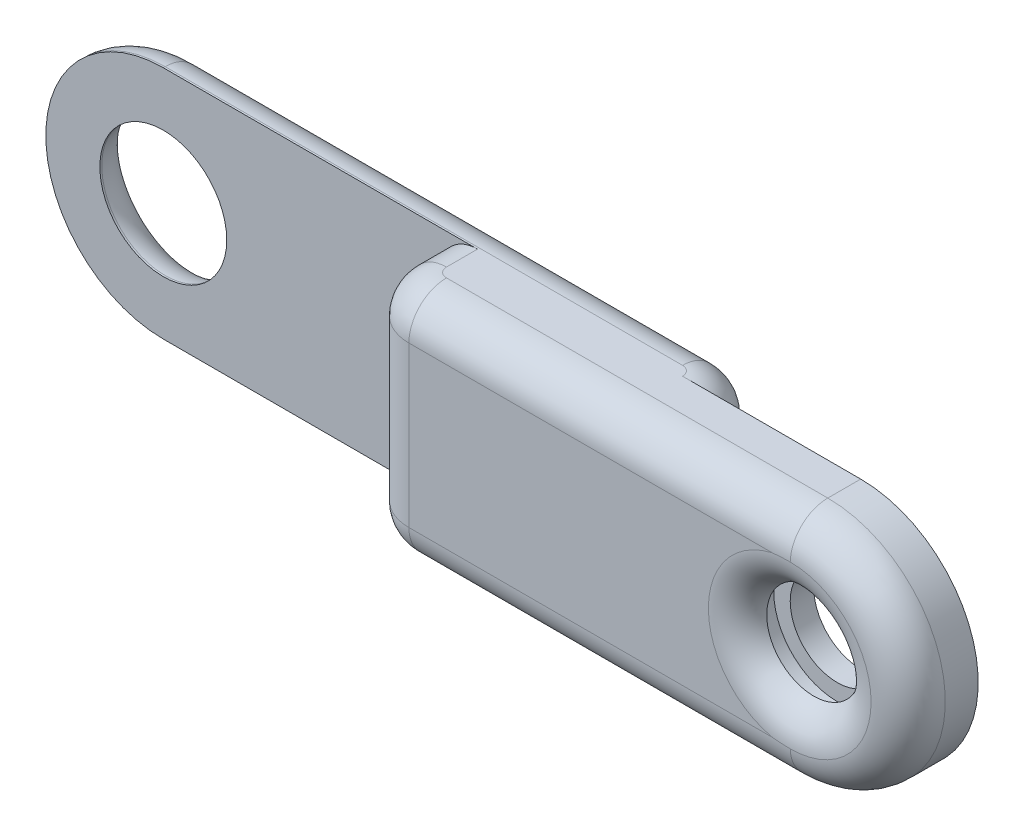
ISO-10303-21;
HEADER;
FILE_DESCRIPTION(('STEP AP214'),'2;1');
FILE_NAME('part.step','',(''),(''),'','','');
FILE_SCHEMA(('AUTOMOTIVE_DESIGN { 1 0 10303 214 1 1 1 1 }'));
ENDSEC;
DATA;
#1=APPLICATION_CONTEXT('core data for automotive mechanical design processes');
#2=APPLICATION_PROTOCOL_DEFINITION('international standard','automotive_design',2000,#1);
#3=PRODUCT_CONTEXT('',#1,'mechanical');
#4=PRODUCT('Part','Part','',(#3));
#5=PRODUCT_RELATED_PRODUCT_CATEGORY('part','',(#4));
#6=PRODUCT_DEFINITION_FORMATION('','',#4);
#7=PRODUCT_DEFINITION_CONTEXT('part definition',#1,'design');
#8=PRODUCT_DEFINITION('design','',#6,#7);
#9=PRODUCT_DEFINITION_SHAPE('','',#8);
#10=(LENGTH_UNIT() NAMED_UNIT(*) SI_UNIT(.MILLI.,.METRE.));
#11=(NAMED_UNIT(*) PLANE_ANGLE_UNIT() SI_UNIT($,.RADIAN.));
#12=(NAMED_UNIT(*) SI_UNIT($,.STERADIAN.) SOLID_ANGLE_UNIT());
#13=UNCERTAINTY_MEASURE_WITH_UNIT(LENGTH_MEASURE(1.E-05),#10,'distance_accuracy_value','');
#14=(GEOMETRIC_REPRESENTATION_CONTEXT(3) GLOBAL_UNCERTAINTY_ASSIGNED_CONTEXT((#13)) GLOBAL_UNIT_ASSIGNED_CONTEXT((#10,
#11,#12)) REPRESENTATION_CONTEXT('',''));
#15=CARTESIAN_POINT('',(0.,0.,0.));
#16=DIRECTION('',(0.,0.,1.));
#17=DIRECTION('',(1.,0.,0.));
#18=AXIS2_PLACEMENT_3D('',#15,#16,#17);
#19=CARTESIAN_POINT('',(-154.944852941176,0.,25.));
#20=DIRECTION('',(0.,0.,-1.));
#21=DIRECTION('',(-1.,0.,0.));
#22=AXIS2_PLACEMENT_3D('',#19,#20,#21);
#23=CYLINDRICAL_SURFACE('',#22,25.);
#24=DIRECTION('',(0.,0.,-1.));
#25=VECTOR('',#24,1.);
#26=CARTESIAN_POINT('',(-154.944852941176,25.,25.));
#27=LINE('',#26,#25);
#28=CARTESIAN_POINT('',(-154.944852941176,25.,8.4));
#29=VERTEX_POINT('',#28);
#30=CARTESIAN_POINT('',(-154.944852941176,25.,8.));
#31=VERTEX_POINT('',#30);
#32=EDGE_CURVE('E509',#29,#31,#27,.T.);
#33=ORIENTED_EDGE('',*,*,#32,.T.);
#34=CARTESIAN_POINT('',(-154.944852941176,0.,8.));
#35=DIRECTION('',(0.,0.,1.));
#36=DIRECTION('',(1.,0.,0.));
#37=AXIS2_PLACEMENT_3D('',#34,#35,#36);
#38=CIRCLE('',#37,25.);
#39=CARTESIAN_POINT('',(-154.944852941176,-25.,8.));
#40=VERTEX_POINT('',#39);
#41=EDGE_CURVE('E302',#31,#40,#38,.T.);
#42=ORIENTED_EDGE('',*,*,#41,.T.);
#43=DIRECTION('',(0.,0.,-1.));
#44=VECTOR('',#43,1.);
#45=CARTESIAN_POINT('',(-154.944852941176,-25.,25.));
#46=LINE('',#45,#44);
#47=CARTESIAN_POINT('',(-154.944852941176,-25.,8.4));
#48=VERTEX_POINT('',#47);
#49=EDGE_CURVE('E518',#48,#40,#46,.T.);
#50=ORIENTED_EDGE('',*,*,#49,.F.);
#51=CARTESIAN_POINT('',(-154.944852941176,0.,8.4));
#52=DIRECTION('',(0.,0.,1.));
#53=DIRECTION('',(1.,0.,0.));
#54=AXIS2_PLACEMENT_3D('',#51,#52,#53);
#55=CIRCLE('',#54,25.);
#56=EDGE_CURVE('E245',#29,#48,#55,.T.);
#57=ORIENTED_EDGE('',*,*,#56,.F.);
#58=EDGE_LOOP('',(#33,#42,#50,#57));
#59=FACE_BOUND('',#58,.T.);
#60=ADVANCED_FACE('F42',(#59),#23,.T.);
#61=CARTESIAN_POINT('',(-154.944852941176,0.,0.));
#62=DIRECTION('',(0.,0.,1.));
#63=DIRECTION('',(1.,0.,0.));
#64=AXIS2_PLACEMENT_3D('',#61,#62,#63);
#65=CYLINDRICAL_SURFACE('',#64,13.5);
#66=CARTESIAN_POINT('',(-154.944852941176,0.,8.));
#67=DIRECTION('',(0.,0.,1.));
#68=DIRECTION('',(1.,0.,0.));
#69=AXIS2_PLACEMENT_3D('',#66,#67,#68);
#70=CIRCLE('',#69,13.5);
#71=CARTESIAN_POINT('',(-141.444852941176,0.,8.));
#72=VERTEX_POINT('',#71);
#73=EDGE_CURVE('E314',#72,#72,#70,.F.);
#74=ORIENTED_EDGE('',*,*,#73,.T.);
#75=EDGE_LOOP('',(#74));
#76=FACE_BOUND('',#75,.T.);
#77=CARTESIAN_POINT('',(-154.944852941176,0.,8.4));
#78=DIRECTION('',(0.,0.,1.));
#79=DIRECTION('',(1.,0.,0.));
#80=AXIS2_PLACEMENT_3D('',#77,#78,#79);
#81=CIRCLE('',#80,13.5);
#82=CARTESIAN_POINT('',(-141.444852941176,0.,8.4));
#83=VERTEX_POINT('',#82);
#84=EDGE_CURVE('E532',#83,#83,#81,.F.);
#85=ORIENTED_EDGE('',*,*,#84,.F.);
#86=EDGE_LOOP('',(#85));
#87=FACE_BOUND('',#86,.T.);
#88=ADVANCED_FACE('F131',(#76,#87),#65,.F.);
#89=CARTESIAN_POINT('',(-4.94485294117644,0.,25.));
#90=DIRECTION('',(0.,0.,-1.));
#91=DIRECTION('',(-1.,0.,0.));
#92=AXIS2_PLACEMENT_3D('',#89,#90,#91);
#93=CYLINDRICAL_SURFACE('',#92,25.);
#94=DIRECTION('',(0.,0.,-1.));
#95=VECTOR('',#94,1.);
#96=CARTESIAN_POINT('',(-4.94485294117644,25.,25.));
#97=LINE('',#96,#95);
#98=CARTESIAN_POINT('',(-4.94485294117644,25.,17.));
#99=VERTEX_POINT('',#98);
#100=CARTESIAN_POINT('',(-4.94485294117644,25.,10.));
#101=VERTEX_POINT('',#100);
#102=EDGE_CURVE('E512',#99,#101,#97,.T.);
#103=ORIENTED_EDGE('',*,*,#102,.F.);
#104=CARTESIAN_POINT('',(-4.94485294117644,0.,17.));
#105=DIRECTION('',(0.,0.,1.));
#106=DIRECTION('',(1.,0.,0.));
#107=AXIS2_PLACEMENT_3D('',#104,#105,#106);
#108=CIRCLE('',#107,25.);
#109=CARTESIAN_POINT('',(-4.94485294117645,-25.,17.));
#110=VERTEX_POINT('',#109);
#111=EDGE_CURVE('E306',#99,#110,#108,.F.);
#112=ORIENTED_EDGE('',*,*,#111,.T.);
#113=DIRECTION('',(0.,0.,-1.));
#114=VECTOR('',#113,1.);
#115=CARTESIAN_POINT('',(-4.94485294117645,-25.,25.));
#116=LINE('',#115,#114);
#117=CARTESIAN_POINT('',(-4.94485294117644,-25.,10.));
#118=VERTEX_POINT('',#117);
#119=EDGE_CURVE('E515',#110,#118,#116,.T.);
#120=ORIENTED_EDGE('',*,*,#119,.T.);
#121=CARTESIAN_POINT('',(-4.94485294117644,0.,10.));
#122=DIRECTION('',(0.,0.,-1.));
#123=DIRECTION('',(-1.,0.,0.));
#124=AXIS2_PLACEMENT_3D('',#121,#122,#123);
#125=CIRCLE('',#124,25.);
#126=EDGE_CURVE('E497',#101,#118,#125,.T.);
#127=ORIENTED_EDGE('',*,*,#126,.F.);
#128=EDGE_LOOP('',(#103,#112,#120,#127));
#129=FACE_BOUND('',#128,.T.);
#130=ADVANCED_FACE('F139',(#129),#93,.T.);
#131=CARTESIAN_POINT('',(-4.94485294117644,0.,15.));
#132=DIRECTION('',(0.,0.,-1.));
#133=DIRECTION('',(-1.,0.,0.));
#134=AXIS2_PLACEMENT_3D('',#131,#132,#133);
#135=CYLINDRICAL_SURFACE('',#134,9.99999999999997);
#136=CARTESIAN_POINT('',(-4.94485294117644,0.,15.));
#137=DIRECTION('',(0.,0.,-1.));
#138=DIRECTION('',(-1.,0.,0.));
#139=AXIS2_PLACEMENT_3D('',#136,#137,#138);
#140=CIRCLE('',#139,9.99999999999997);
#141=CARTESIAN_POINT('',(-14.9448529411764,0.,15.));
#142=VERTEX_POINT('',#141);
#143=EDGE_CURVE('E501',#142,#142,#140,.T.);
#144=ORIENTED_EDGE('',*,*,#143,.F.);
#145=EDGE_LOOP('',(#144));
#146=FACE_BOUND('',#145,.T.);
#147=CARTESIAN_POINT('',(-4.94485294117644,0.,10.));
#148=DIRECTION('',(0.,0.,-1.));
#149=DIRECTION('',(-1.,0.,0.));
#150=AXIS2_PLACEMENT_3D('',#147,#148,#149);
#151=CIRCLE('',#150,9.99999999999997);
#152=CARTESIAN_POINT('',(-14.9448529411764,0.,10.));
#153=VERTEX_POINT('',#152);
#154=EDGE_CURVE('E495',#153,#153,#151,.F.);
#155=ORIENTED_EDGE('',*,*,#154,.F.);
#156=EDGE_LOOP('',(#155));
#157=FACE_BOUND('',#156,.T.);
#158=ADVANCED_FACE('F565',(#146,#157),#135,.F.);
#159=CARTESIAN_POINT('',(-4.94485294117644,0.,0.));
#160=DIRECTION('',(0.,0.,1.));
#161=DIRECTION('',(1.,0.,0.));
#162=AXIS2_PLACEMENT_3D('',#159,#160,#161);
#163=CYLINDRICAL_SURFACE('',#162,13.4999999999999);
#164=CARTESIAN_POINT('',(-4.94485294117644,0.,20.));
#165=DIRECTION('',(0.,0.,1.));
#166=DIRECTION('',(1.,0.,0.));
#167=AXIS2_PLACEMENT_3D('',#164,#165,#166);
#168=CIRCLE('',#167,13.4999999999999);
#169=CARTESIAN_POINT('',(8.5551470588235,0.,20.));
#170=VERTEX_POINT('',#169);
#171=EDGE_CURVE('E521',#170,#170,#168,.F.);
#172=ORIENTED_EDGE('',*,*,#171,.F.);
#173=EDGE_LOOP('',(#172));
#174=FACE_BOUND('',#173,.T.);
#175=CARTESIAN_POINT('',(-4.94485294117644,0.,15.));
#176=DIRECTION('',(0.,0.,-1.));
#177=DIRECTION('',(-1.,0.,0.));
#178=AXIS2_PLACEMENT_3D('',#175,#176,#177);
#179=CIRCLE('',#178,13.4999999999999);
#180=CARTESIAN_POINT('',(-18.4448529411764,0.,15.));
#181=VERTEX_POINT('',#180);
#182=EDGE_CURVE('E525',#181,#181,#179,.F.);
#183=ORIENTED_EDGE('',*,*,#182,.F.);
#184=EDGE_LOOP('',(#183));
#185=FACE_BOUND('',#184,.T.);
#186=ADVANCED_FACE('F570',(#174,#185),#163,.F.);
#187=CARTESIAN_POINT('',(-154.944852941176,-25.,25.));
#188=DIRECTION('',(0.,1.,0.));
#189=DIRECTION('',(0.,0.,1.));
#190=AXIS2_PLACEMENT_3D('',#187,#188,#189);
#191=PLANE('',#190);
#192=DIRECTION('',(0.,0.,1.));
#193=VECTOR('',#192,1.);
#194=CARTESIAN_POINT('',(-88.0847887574658,-25.,25.));
#195=LINE('',#194,#193);
#196=CARTESIAN_POINT('',(-88.0847887574658,-25.,15.));
#197=VERTEX_POINT('',#196);
#198=CARTESIAN_POINT('',(-88.0847887574658,-25.,8.4));
#199=VERTEX_POINT('',#198);
#200=EDGE_CURVE('E437',#197,#199,#195,.F.);
#201=ORIENTED_EDGE('',*,*,#200,.T.);
#202=DIRECTION('',(1.,0.,0.));
#203=VECTOR('',#202,1.);
#204=CARTESIAN_POINT('',(-96.0847887574658,-25.,8.4));
#205=LINE('',#204,#203);
#206=EDGE_CURVE('E545',#48,#199,#205,.T.);
#207=ORIENTED_EDGE('',*,*,#206,.F.);
#208=ORIENTED_EDGE('',*,*,#49,.T.);
#209=DIRECTION('',(1.,0.,0.));
#210=VECTOR('',#209,1.);
#211=CARTESIAN_POINT('',(-154.944852941176,-25.,8.));
#212=LINE('',#211,#210);
#213=CARTESIAN_POINT('',(-44.8505925481879,-25.,8.));
#214=VERTEX_POINT('',#213);
#215=EDGE_CURVE('E94',#40,#214,#212,.T.);
#216=ORIENTED_EDGE('',*,*,#215,.T.);
#217=CARTESIAN_POINT('',(-44.8505925481879,-25.,10.));
#218=DIRECTION('',(0.,1.,0.));
#219=DIRECTION('',(0.,0.,1.));
#220=AXIS2_PLACEMENT_3D('',#217,#218,#219);
#221=CIRCLE('',#220,2.);
#222=CARTESIAN_POINT('',(-42.8505925481879,-25.,10.));
#223=VERTEX_POINT('',#222);
#224=EDGE_CURVE('E442',#214,#223,#221,.F.);
#225=ORIENTED_EDGE('',*,*,#224,.T.);
#226=DIRECTION('',(-1.,0.,0.));
#227=VECTOR('',#226,1.);
#228=CARTESIAN_POINT('',(-4.94485294117644,-25.,10.));
#229=LINE('',#228,#227);
#230=EDGE_CURVE('E478',#118,#223,#229,.T.);
#231=ORIENTED_EDGE('',*,*,#230,.F.);
#232=ORIENTED_EDGE('',*,*,#119,.F.);
#233=DIRECTION('',(1.,0.,0.));
#234=VECTOR('',#233,1.);
#235=CARTESIAN_POINT('',(-86.0847887574658,-25.,17.));
#236=LINE('',#235,#234);
#237=CARTESIAN_POINT('',(-86.0847887574658,-25.,17.));
#238=VERTEX_POINT('',#237);
#239=EDGE_CURVE('E347',#110,#238,#236,.F.);
#240=ORIENTED_EDGE('',*,*,#239,.T.);
#241=CARTESIAN_POINT('',(-86.0847887574658,-25.,15.));
#242=DIRECTION('',(0.,1.,0.));
#243=DIRECTION('',(0.,0.,1.));
#244=AXIS2_PLACEMENT_3D('',#241,#242,#243);
#245=CIRCLE('',#244,2.);
#246=EDGE_CURVE('E432',#238,#197,#245,.F.);
#247=ORIENTED_EDGE('',*,*,#246,.T.);
#248=EDGE_LOOP('',(#201,#207,#208,#216,#225,#231,#232,#240,#247));
#249=FACE_BOUND('',#248,.T.);
#250=ADVANCED_FACE('F145',(#249),#191,.F.);
#251=CARTESIAN_POINT('',(-154.944852941176,25.,25.));
#252=DIRECTION('',(0.,-1.,0.));
#253=DIRECTION('',(0.,0.,-1.));
#254=AXIS2_PLACEMENT_3D('',#251,#252,#253);
#255=PLANE('',#254);
#256=DIRECTION('',(-1.,0.,0.));
#257=VECTOR('',#256,1.);
#258=CARTESIAN_POINT('',(-154.944852941176,25.,8.4));
#259=LINE('',#258,#257);
#260=CARTESIAN_POINT('',(-88.0847887574658,25.,8.4));
#261=VERTEX_POINT('',#260);
#262=EDGE_CURVE('E237',#261,#29,#259,.T.);
#263=ORIENTED_EDGE('',*,*,#262,.F.);
#264=DIRECTION('',(0.,0.,1.));
#265=VECTOR('',#264,1.);
#266=CARTESIAN_POINT('',(-88.0847887574658,25.,25.));
#267=LINE('',#266,#265);
#268=CARTESIAN_POINT('',(-88.0847887574658,25.,15.));
#269=VERTEX_POINT('',#268);
#270=EDGE_CURVE('E408',#261,#269,#267,.T.);
#271=ORIENTED_EDGE('',*,*,#270,.T.);
#272=CARTESIAN_POINT('',(-86.0847887574658,25.,15.));
#273=DIRECTION('',(0.,-1.,0.));
#274=DIRECTION('',(0.,0.,-1.));
#275=AXIS2_PLACEMENT_3D('',#272,#273,#274);
#276=CIRCLE('',#275,2.);
#277=CARTESIAN_POINT('',(-86.0847887574658,25.,17.));
#278=VERTEX_POINT('',#277);
#279=EDGE_CURVE('E264',#269,#278,#276,.F.);
#280=ORIENTED_EDGE('',*,*,#279,.T.);
#281=DIRECTION('',(-1.,0.,0.));
#282=VECTOR('',#281,1.);
#283=CARTESIAN_POINT('',(-4.94485294117644,25.,17.));
#284=LINE('',#283,#282);
#285=EDGE_CURVE('E258',#278,#99,#284,.F.);
#286=ORIENTED_EDGE('',*,*,#285,.T.);
#287=ORIENTED_EDGE('',*,*,#102,.T.);
#288=DIRECTION('',(1.,0.,0.));
#289=VECTOR('',#288,1.);
#290=CARTESIAN_POINT('',(-4.94485294117644,25.,10.));
#291=LINE('',#290,#289);
#292=CARTESIAN_POINT('',(-42.8505925481879,25.,10.));
#293=VERTEX_POINT('',#292);
#294=EDGE_CURVE('E399',#293,#101,#291,.T.);
#295=ORIENTED_EDGE('',*,*,#294,.F.);
#296=CARTESIAN_POINT('',(-44.8505925481879,25.,10.));
#297=DIRECTION('',(0.,-1.,0.));
#298=DIRECTION('',(0.,0.,-1.));
#299=AXIS2_PLACEMENT_3D('',#296,#297,#298);
#300=CIRCLE('',#299,2.);
#301=CARTESIAN_POINT('',(-44.8505925481879,25.,8.));
#302=VERTEX_POINT('',#301);
#303=EDGE_CURVE('E388',#293,#302,#300,.F.);
#304=ORIENTED_EDGE('',*,*,#303,.T.);
#305=DIRECTION('',(-1.,0.,0.));
#306=VECTOR('',#305,1.);
#307=CARTESIAN_POINT('',(-154.944852941176,25.,8.));
#308=LINE('',#307,#306);
#309=EDGE_CURVE('E391',#302,#31,#308,.T.);
#310=ORIENTED_EDGE('',*,*,#309,.T.);
#311=ORIENTED_EDGE('',*,*,#32,.F.);
#312=EDGE_LOOP('',(#263,#271,#280,#286,#287,#295,#304,#310,#311));
#313=FACE_BOUND('',#312,.T.);
#314=ADVANCED_FACE('F396',(#313),#255,.F.);
#315=CARTESIAN_POINT('',(-154.944852941176,0.,25.));
#316=DIRECTION('',(0.,0.,1.));
#317=DIRECTION('',(1.,0.,0.));
#318=AXIS2_PLACEMENT_3D('',#315,#316,#317);
#319=PLANE('',#318);
#320=DIRECTION('',(0.,1.,0.));
#321=VECTOR('',#320,1.);
#322=CARTESIAN_POINT('',(-86.0847887574658,-25.,25.));
#323=LINE('',#322,#321);
#324=CARTESIAN_POINT('',(-86.0847887574658,17.,25.));
#325=VERTEX_POINT('',#324);
#326=CARTESIAN_POINT('',(-86.0847887574658,-17.,25.));
#327=VERTEX_POINT('',#326);
#328=EDGE_CURVE('E429',#325,#327,#323,.F.);
#329=ORIENTED_EDGE('',*,*,#328,.T.);
#330=DIRECTION('',(1.,0.,0.));
#331=VECTOR('',#330,1.);
#332=CARTESIAN_POINT('',(-4.94485294117644,-17.,25.));
#333=LINE('',#332,#331);
#334=CARTESIAN_POINT('',(-8.72955500896362,-17.,25.));
#335=VERTEX_POINT('',#334);
#336=EDGE_CURVE('E421',#327,#335,#333,.T.);
#337=ORIENTED_EDGE('',*,*,#336,.T.);
#338=CARTESIAN_POINT('',(-4.94485294117644,0.,25.));
#339=DIRECTION('',(0.,0.,1.));
#340=DIRECTION('',(1.,0.,0.));
#341=AXIS2_PLACEMENT_3D('',#338,#339,#340);
#342=CIRCLE('',#341,17.4161984870956);
#343=CARTESIAN_POINT('',(-8.72955500896362,17.,25.));
#344=VERTEX_POINT('',#343);
#345=EDGE_CURVE('E418',#335,#344,#342,.F.);
#346=ORIENTED_EDGE('',*,*,#345,.T.);
#347=DIRECTION('',(-1.,0.,0.));
#348=VECTOR('',#347,1.);
#349=CARTESIAN_POINT('',(-86.0847887574658,17.,25.));
#350=LINE('',#349,#348);
#351=EDGE_CURVE('E254',#344,#325,#350,.T.);
#352=ORIENTED_EDGE('',*,*,#351,.T.);
#353=EDGE_LOOP('',(#329,#337,#346,#352));
#354=FACE_BOUND('',#353,.T.);
#355=ADVANCED_FACE('F427',(#354),#319,.T.);
#356=CARTESIAN_POINT('',(-154.944852941176,0.,0.));
#357=DIRECTION('',(0.,0.,1.));
#358=DIRECTION('',(1.,0.,0.));
#359=AXIS2_PLACEMENT_3D('',#356,#357,#358);
#360=PLANE('',#359);
#361=DIRECTION('',(0.,1.,0.));
#362=VECTOR('',#361,1.);
#363=CARTESIAN_POINT('',(-44.8505925481879,0.,0.));
#364=LINE('',#363,#362);
#365=CARTESIAN_POINT('',(-44.8505925481879,17.,0.));
#366=VERTEX_POINT('',#365);
#367=CARTESIAN_POINT('',(-44.8505925481879,-17.,0.));
#368=VERTEX_POINT('',#367);
#369=EDGE_CURVE('E469',#366,#368,#364,.F.);
#370=ORIENTED_EDGE('',*,*,#369,.T.);
#371=DIRECTION('',(1.,0.,0.));
#372=VECTOR('',#371,1.);
#373=CARTESIAN_POINT('',(-154.944852941176,-17.,0.));
#374=LINE('',#373,#372);
#375=CARTESIAN_POINT('',(-141.782406360088,-17.,0.));
#376=VERTEX_POINT('',#375);
#377=EDGE_CURVE('E62',#368,#376,#374,.F.);
#378=ORIENTED_EDGE('',*,*,#377,.T.);
#379=CARTESIAN_POINT('',(-154.944852941176,0.,0.));
#380=DIRECTION('',(0.,0.,1.));
#381=DIRECTION('',(1.,0.,0.));
#382=AXIS2_PLACEMENT_3D('',#379,#380,#381);
#383=CIRCLE('',#382,21.5);
#384=CARTESIAN_POINT('',(-133.444852941176,0.,0.));
#385=VERTEX_POINT('',#384);
#386=EDGE_CURVE('E106',#376,#385,#383,.T.);
#387=ORIENTED_EDGE('',*,*,#386,.T.);
#388=CARTESIAN_POINT('',(-154.944852941176,0.,0.));
#389=DIRECTION('',(0.,0.,1.));
#390=DIRECTION('',(1.,0.,0.));
#391=AXIS2_PLACEMENT_3D('',#388,#389,#390);
#392=CIRCLE('',#391,21.5);
#393=CARTESIAN_POINT('',(-141.782406360088,17.,0.));
#394=VERTEX_POINT('',#393);
#395=EDGE_CURVE('E296',#385,#394,#392,.T.);
#396=ORIENTED_EDGE('',*,*,#395,.T.);
#397=DIRECTION('',(-1.,0.,0.));
#398=VECTOR('',#397,1.);
#399=CARTESIAN_POINT('',(-154.944852941176,17.,0.));
#400=LINE('',#399,#398);
#401=EDGE_CURVE('E298',#394,#366,#400,.F.);
#402=ORIENTED_EDGE('',*,*,#401,.T.);
#403=EDGE_LOOP('',(#370,#378,#387,#396,#402));
#404=FACE_BOUND('',#403,.T.);
#405=ADVANCED_FACE('F295',(#404),#360,.F.);
#406=CARTESIAN_POINT('',(-4.94485294117644,0.,20.));
#407=DIRECTION('',(0.,0.,1.));
#408=DIRECTION('',(1.,0.,0.));
#409=AXIS2_PLACEMENT_3D('',#406,#407,#408);
#410=PLANE('',#409);
#411=CARTESIAN_POINT('',(-4.94485294117644,0.,20.));
#412=DIRECTION('',(0.,0.,1.));
#413=DIRECTION('',(1.,0.,0.));
#414=AXIS2_PLACEMENT_3D('',#411,#412,#413);
#415=CIRCLE('',#414,9.99999999999998);
#416=CARTESIAN_POINT('',(5.05514705882354,0.,20.));
#417=VERTEX_POINT('',#416);
#418=EDGE_CURVE('E505',#417,#417,#415,.T.);
#419=ORIENTED_EDGE('',*,*,#418,.T.);
#420=EDGE_LOOP('',(#419));
#421=FACE_BOUND('',#420,.T.);
#422=ORIENTED_EDGE('',*,*,#171,.T.);
#423=EDGE_LOOP('',(#422));
#424=FACE_BOUND('',#423,.T.);
#425=ADVANCED_FACE('F577',(#421,#424),#410,.F.);
#426=CARTESIAN_POINT('',(-4.94485294117644,0.,15.));
#427=DIRECTION('',(0.,0.,-1.));
#428=DIRECTION('',(-1.,0.,0.));
#429=AXIS2_PLACEMENT_3D('',#426,#427,#428);
#430=PLANE('',#429);
#431=ORIENTED_EDGE('',*,*,#143,.T.);
#432=EDGE_LOOP('',(#431));
#433=FACE_BOUND('',#432,.T.);
#434=ORIENTED_EDGE('',*,*,#182,.T.);
#435=EDGE_LOOP('',(#434));
#436=FACE_BOUND('',#435,.T.);
#437=ADVANCED_FACE('F585',(#433,#436),#430,.F.);
#438=CARTESIAN_POINT('',(-4.94485294117644,0.,10.));
#439=DIRECTION('',(0.,0.,-1.));
#440=DIRECTION('',(-1.,0.,0.));
#441=AXIS2_PLACEMENT_3D('',#438,#439,#440);
#442=PLANE('',#441);
#443=ORIENTED_EDGE('',*,*,#126,.T.);
#444=ORIENTED_EDGE('',*,*,#230,.T.);
#445=CARTESIAN_POINT('',(-42.8505925481879,-17.,10.));
#446=DIRECTION('',(0.,0.,-1.));
#447=DIRECTION('',(-1.,0.,0.));
#448=AXIS2_PLACEMENT_3D('',#445,#446,#447);
#449=CIRCLE('',#448,8.);
#450=CARTESIAN_POINT('',(-34.8505925481879,-17.,10.));
#451=VERTEX_POINT('',#450);
#452=EDGE_CURVE('E11',#223,#451,#449,.F.);
#453=ORIENTED_EDGE('',*,*,#452,.T.);
#454=DIRECTION('',(0.,1.,0.));
#455=VECTOR('',#454,1.);
#456=CARTESIAN_POINT('',(-34.8505925481879,-25.,10.));
#457=LINE('',#456,#455);
#458=CARTESIAN_POINT('',(-34.8505925481879,17.,10.));
#459=VERTEX_POINT('',#458);
#460=EDGE_CURVE('E489',#451,#459,#457,.T.);
#461=ORIENTED_EDGE('',*,*,#460,.T.);
#462=CARTESIAN_POINT('',(-42.8505925481879,17.,10.));
#463=DIRECTION('',(0.,0.,-1.));
#464=DIRECTION('',(-1.,0.,0.));
#465=AXIS2_PLACEMENT_3D('',#462,#463,#464);
#466=CIRCLE('',#465,8.);
#467=EDGE_CURVE('E53',#459,#293,#466,.F.);
#468=ORIENTED_EDGE('',*,*,#467,.T.);
#469=ORIENTED_EDGE('',*,*,#294,.T.);
#470=EDGE_LOOP('',(#443,#444,#453,#461,#468,#469));
#471=FACE_BOUND('',#470,.T.);
#472=ORIENTED_EDGE('',*,*,#154,.T.);
#473=EDGE_LOOP('',(#472));
#474=FACE_BOUND('',#473,.T.);
#475=ADVANCED_FACE('F487',(#471,#474),#442,.T.);
#476=CARTESIAN_POINT('',(-154.944852941176,0.,8.4));
#477=DIRECTION('',(0.,0.,1.));
#478=DIRECTION('',(1.,0.,0.));
#479=AXIS2_PLACEMENT_3D('',#476,#477,#478);
#480=PLANE('',#479);
#481=ORIENTED_EDGE('',*,*,#262,.T.);
#482=ORIENTED_EDGE('',*,*,#56,.T.);
#483=ORIENTED_EDGE('',*,*,#206,.T.);
#484=CARTESIAN_POINT('',(-88.0847887574658,-17.,8.4));
#485=DIRECTION('',(0.,0.,1.));
#486=DIRECTION('',(1.,0.,0.));
#487=AXIS2_PLACEMENT_3D('',#484,#485,#486);
#488=CIRCLE('',#487,8.);
#489=CARTESIAN_POINT('',(-96.0847887574658,-17.,8.4));
#490=VERTEX_POINT('',#489);
#491=EDGE_CURVE('E318',#199,#490,#488,.F.);
#492=ORIENTED_EDGE('',*,*,#491,.T.);
#493=DIRECTION('',(0.,1.,0.));
#494=VECTOR('',#493,1.);
#495=CARTESIAN_POINT('',(-96.0847887574658,25.,8.4));
#496=LINE('',#495,#494);
#497=CARTESIAN_POINT('',(-96.0847887574658,17.,8.4));
#498=VERTEX_POINT('',#497);
#499=EDGE_CURVE('E461',#490,#498,#496,.T.);
#500=ORIENTED_EDGE('',*,*,#499,.T.);
#501=CARTESIAN_POINT('',(-88.0847887574658,17.,8.4));
#502=DIRECTION('',(0.,0.,1.));
#503=DIRECTION('',(1.,0.,0.));
#504=AXIS2_PLACEMENT_3D('',#501,#502,#503);
#505=CIRCLE('',#504,8.);
#506=EDGE_CURVE('E322',#498,#261,#505,.F.);
#507=ORIENTED_EDGE('',*,*,#506,.T.);
#508=EDGE_LOOP('',(#481,#482,#483,#492,#500,#507));
#509=FACE_BOUND('',#508,.T.);
#510=ORIENTED_EDGE('',*,*,#84,.T.);
#511=EDGE_LOOP('',(#510));
#512=FACE_BOUND('',#511,.T.);
#513=ADVANCED_FACE('F557',(#509,#512),#480,.T.);
#514=CARTESIAN_POINT('',(-96.0847887574658,25.,8.4));
#515=DIRECTION('',(1.,0.,0.));
#516=DIRECTION('',(0.,0.,-1.));
#517=AXIS2_PLACEMENT_3D('',#514,#515,#516);
#518=PLANE('',#517);
#519=ORIENTED_EDGE('',*,*,#499,.F.);
#520=DIRECTION('',(0.,0.,1.));
#521=VECTOR('',#520,1.);
#522=CARTESIAN_POINT('',(-96.0847887574658,-17.,8.4));
#523=LINE('',#522,#521);
#524=CARTESIAN_POINT('',(-96.0847887574658,-17.,15.));
#525=VERTEX_POINT('',#524);
#526=EDGE_CURVE('E458',#490,#525,#523,.T.);
#527=ORIENTED_EDGE('',*,*,#526,.T.);
#528=DIRECTION('',(0.,1.,0.));
#529=VECTOR('',#528,1.);
#530=CARTESIAN_POINT('',(-96.0847887574658,25.,15.));
#531=LINE('',#530,#529);
#532=CARTESIAN_POINT('',(-96.0847887574658,17.,15.));
#533=VERTEX_POINT('',#532);
#534=EDGE_CURVE('E451',#525,#533,#531,.T.);
#535=ORIENTED_EDGE('',*,*,#534,.T.);
#536=DIRECTION('',(0.,0.,1.));
#537=VECTOR('',#536,1.);
#538=CARTESIAN_POINT('',(-96.0847887574658,17.,8.4));
#539=LINE('',#538,#537);
#540=EDGE_CURVE('E464',#533,#498,#539,.F.);
#541=ORIENTED_EDGE('',*,*,#540,.T.);
#542=EDGE_LOOP('',(#519,#527,#535,#541));
#543=FACE_BOUND('',#542,.T.);
#544=ADVANCED_FACE('F151',(#543),#518,.F.);
#545=CARTESIAN_POINT('',(-86.0847887574658,25.,15.));
#546=DIRECTION('',(0.,-1.,0.));
#547=DIRECTION('',(0.,0.,-1.));
#548=AXIS2_PLACEMENT_3D('',#545,#546,#547);
#549=CYLINDRICAL_SURFACE('',#548,10.);
#550=ORIENTED_EDGE('',*,*,#534,.F.);
#551=CARTESIAN_POINT('',(-86.0847887574658,-17.,15.));
#552=DIRECTION('',(0.,1.,0.));
#553=DIRECTION('',(0.,0.,1.));
#554=AXIS2_PLACEMENT_3D('',#551,#552,#553);
#555=CIRCLE('',#554,10.);
#556=EDGE_CURVE('E394',#525,#327,#555,.T.);
#557=ORIENTED_EDGE('',*,*,#556,.T.);
#558=ORIENTED_EDGE('',*,*,#328,.F.);
#559=CARTESIAN_POINT('',(-86.0847887574658,17.,15.));
#560=DIRECTION('',(0.,-1.,0.));
#561=DIRECTION('',(0.,0.,-1.));
#562=AXIS2_PLACEMENT_3D('',#559,#560,#561);
#563=CIRCLE('',#562,10.);
#564=EDGE_CURVE('E266',#325,#533,#563,.T.);
#565=ORIENTED_EDGE('',*,*,#564,.T.);
#566=EDGE_LOOP('',(#550,#557,#558,#565));
#567=FACE_BOUND('',#566,.T.);
#568=ADVANCED_FACE('F147',(#567),#549,.T.);
#569=CARTESIAN_POINT('',(-44.8505925481879,-25.,10.));
#570=DIRECTION('',(0.,1.,0.));
#571=DIRECTION('',(0.,0.,1.));
#572=AXIS2_PLACEMENT_3D('',#569,#570,#571);
#573=CYLINDRICAL_SURFACE('',#572,10.);
#574=ORIENTED_EDGE('',*,*,#369,.F.);
#575=CARTESIAN_POINT('',(-44.8505925481879,17.,10.));
#576=DIRECTION('',(0.,-1.,0.));
#577=DIRECTION('',(0.,0.,-1.));
#578=AXIS2_PLACEMENT_3D('',#575,#576,#577);
#579=CIRCLE('',#578,10.);
#580=EDGE_CURVE('E389',#366,#459,#579,.T.);
#581=ORIENTED_EDGE('',*,*,#580,.T.);
#582=ORIENTED_EDGE('',*,*,#460,.F.);
#583=CARTESIAN_POINT('',(-44.8505925481879,-17.,10.));
#584=DIRECTION('',(0.,1.,0.));
#585=DIRECTION('',(0.,0.,1.));
#586=AXIS2_PLACEMENT_3D('',#583,#584,#585);
#587=CIRCLE('',#586,10.);
#588=EDGE_CURVE('E411',#451,#368,#587,.T.);
#589=ORIENTED_EDGE('',*,*,#588,.T.);
#590=EDGE_LOOP('',(#574,#581,#582,#589));
#591=FACE_BOUND('',#590,.T.);
#592=ADVANCED_FACE('F150',(#591),#573,.T.);
#593=CARTESIAN_POINT('',(-88.0847887574658,17.,25.));
#594=DIRECTION('',(0.,0.,1.));
#595=DIRECTION('',(1.,0.,0.));
#596=AXIS2_PLACEMENT_3D('',#593,#594,#595);
#597=CYLINDRICAL_SURFACE('',#596,8.);
#598=ORIENTED_EDGE('',*,*,#506,.F.);
#599=ORIENTED_EDGE('',*,*,#540,.F.);
#600=CARTESIAN_POINT('',(-88.0847887574658,17.,15.));
#601=DIRECTION('',(0.,0.,1.));
#602=DIRECTION('',(1.,0.,0.));
#603=AXIS2_PLACEMENT_3D('',#600,#601,#602);
#604=CIRCLE('',#603,8.);
#605=EDGE_CURVE('E234',#269,#533,#604,.T.);
#606=ORIENTED_EDGE('',*,*,#605,.F.);
#607=ORIENTED_EDGE('',*,*,#270,.F.);
#608=EDGE_LOOP('',(#598,#599,#606,#607));
#609=FACE_BOUND('',#608,.T.);
#610=ADVANCED_FACE('F155',(#609),#597,.T.);
#611=CARTESIAN_POINT('',(-86.0847887574658,17.,15.));
#612=DIRECTION('',(0.,-1.,0.));
#613=DIRECTION('',(0.,0.,-1.));
#614=AXIS2_PLACEMENT_3D('',#611,#612,#613);
#615=DEGENERATE_TOROIDAL_SURFACE('',#614,2.,8.,.T.);
#616=ORIENTED_EDGE('',*,*,#605,.T.);
#617=ORIENTED_EDGE('',*,*,#564,.F.);
#618=CARTESIAN_POINT('',(-86.0847887574658,17.,17.));
#619=DIRECTION('',(1.,0.,0.));
#620=DIRECTION('',(0.,0.,-1.));
#621=AXIS2_PLACEMENT_3D('',#618,#619,#620);
#622=CIRCLE('',#621,8.);
#623=EDGE_CURVE('E204',#278,#325,#622,.T.);
#624=ORIENTED_EDGE('',*,*,#623,.F.);
#625=ORIENTED_EDGE('',*,*,#279,.F.);
#626=EDGE_LOOP('',(#616,#617,#624,#625));
#627=FACE_BOUND('',#626,.T.);
#628=ADVANCED_FACE('F211',(#627),#615,.T.);
#629=CARTESIAN_POINT('',(-154.944852941176,17.,17.));
#630=DIRECTION('',(1.,0.,0.));
#631=DIRECTION('',(0.,0.,-1.));
#632=AXIS2_PLACEMENT_3D('',#629,#630,#631);
#633=CYLINDRICAL_SURFACE('',#632,8.);
#634=ORIENTED_EDGE('',*,*,#623,.T.);
#635=ORIENTED_EDGE('',*,*,#351,.F.);
#636=CARTESIAN_POINT('',(-4.94465294117644,17.2080992429667,24.9972929610636));
#637=CARTESIAN_POINT('',(-5.25771726620526,17.2081056721934,24.9972781488641));
#638=CARTESIAN_POINT('',(-5.57078187738417,17.2038314172804,24.9974035166275));
#639=CARTESIAN_POINT('',(-6.19670217668428,17.1867537617481,24.9978283739051));
#640=CARTESIAN_POINT('',(-6.50955784714248,17.1739497137167,24.9981278766358));
#641=CARTESIAN_POINT('',(-7.13434324648515,17.1398697907533,24.9987942451243));
#642=CARTESIAN_POINT('',(-7.44627366046073,17.1186064071023,24.9991610111308));
#643=CARTESIAN_POINT('',(-8.06942832092064,17.0676724964533,24.9997545824284));
#644=CARTESIAN_POINT('',(-8.38065262534209,17.0380026863617,24.9999813996492));
#645=CARTESIAN_POINT('',(-8.70412496876196,17.0027894628758,24.999999627816));
#646=CARTESIAN_POINT('',(-8.71684038522155,17.0013982120525,24.9999999939192));
#647=CARTESIAN_POINT('',(-8.72955500896362,17.,25.));
#648=B_SPLINE_CURVE_WITH_KNOTS('',3,(#636,#637,#638,#639,#640,#641,#642,#643,#644,#645,#646,
#647),.UNSPECIFIED.,.F.,.F.,(4,2,2,2,2,4),(0.,0.93916458044661,1.87840045169108,
2.81625453944789,3.75402867036672,3.79240256586349),.UNSPECIFIED.);
#649=CARTESIAN_POINT('',(-4.94485294117644,17.2080992435479,24.9972929610484));
#650=VERTEX_POINT('',#649);
#651=EDGE_CURVE('E194',#650,#344,#648,.T.);
#652=ORIENTED_EDGE('',*,*,#651,.F.);
#653=CARTESIAN_POINT('',(-4.94485294117644,17.,17.));
#654=DIRECTION('',(1.,0.,0.));
#655=DIRECTION('',(0.,0.,-1.));
#656=AXIS2_PLACEMENT_3D('',#653,#654,#655);
#657=CIRCLE('',#656,8.);
#658=EDGE_CURVE('E185',#99,#650,#657,.T.);
#659=ORIENTED_EDGE('',*,*,#658,.F.);
#660=ORIENTED_EDGE('',*,*,#285,.F.);
#661=EDGE_LOOP('',(#634,#635,#652,#659,#660));
#662=FACE_BOUND('',#661,.T.);
#663=ADVANCED_FACE('F171',(#662),#633,.T.);
#664=CARTESIAN_POINT('',(-4.94485294117644,0.,17.));
#665=DIRECTION('',(0.,0.,1.));
#666=DIRECTION('',(1.,0.,0.));
#667=AXIS2_PLACEMENT_3D('',#664,#665,#666);
#668=TOROIDAL_SURFACE('',#667,17.4161984870956,8.);
#669=ORIENTED_EDGE('',*,*,#418,.F.);
#670=EDGE_LOOP('',(#669));
#671=FACE_BOUND('',#670,.T.);
#672=CARTESIAN_POINT('',(-4.94485294117644,0.,24.9972929610484));
#673=DIRECTION('',(0.,0.,1.));
#674=DIRECTION('',(1.,0.,0.));
#675=AXIS2_PLACEMENT_3D('',#672,#673,#674);
#676=CIRCLE('',#675,17.2080992435478);
#677=CARTESIAN_POINT('',(-4.94485294117644,-17.2080992435478,24.9972929610484));
#678=VERTEX_POINT('',#677);
#679=EDGE_CURVE('E191',#650,#678,#676,.F.);
#680=ORIENTED_EDGE('',*,*,#679,.F.);
#681=ORIENTED_EDGE('',*,*,#651,.T.);
#682=ORIENTED_EDGE('',*,*,#345,.F.);
#683=CARTESIAN_POINT('',(-8.72955500896362,-17.,25.));
#684=CARTESIAN_POINT('',(-8.71684038522154,-17.001398212052,24.9999999939192));
#685=CARTESIAN_POINT('',(-8.70412496876195,-17.002789462875,24.999999627816));
#686=CARTESIAN_POINT('',(-8.38065262534073,-17.0380026863515,24.9999813996492));
#687=CARTESIAN_POINT('',(-8.0694283209197,-17.0676724964506,24.9997545824284));
#688=CARTESIAN_POINT('',(-7.44627366045983,-17.1186064071052,24.9991610111308));
#689=CARTESIAN_POINT('',(-7.13434324648386,-17.1398697907542,24.9987942451243));
#690=CARTESIAN_POINT('',(-6.5095578471414,-17.173949713716,24.9981278766358));
#691=CARTESIAN_POINT('',(-6.19670217668381,-17.1867537617477,24.9978283739051));
#692=CARTESIAN_POINT('',(-5.5707818773843,-17.2038314172808,24.9974035166275));
#693=CARTESIAN_POINT('',(-5.25771726620539,-17.2081056721942,24.9972781488641));
#694=CARTESIAN_POINT('',(-4.94465294117644,-17.2080992429667,24.9972929610636));
#695=B_SPLINE_CURVE_WITH_KNOTS('',3,(#683,#684,#685,#686,#687,#688,#689,#690,#691,#692,#693,
#694),.UNSPECIFIED.,.F.,.F.,(4,2,2,2,2,4),(0.,0.0383738954966414,0.976148026416601,
1.91400211417393,2.85323798541673,3.79240256586347),.UNSPECIFIED.);
#696=EDGE_CURVE('E176',#678,#335,#695,.F.);
#697=ORIENTED_EDGE('',*,*,#696,.F.);
#698=EDGE_LOOP('',(#680,#681,#682,#697));
#699=FACE_BOUND('',#698,.T.);
#700=ADVANCED_FACE('F166',(#671,#699),#668,.T.);
#701=CARTESIAN_POINT('',(-4.94485294117644,0.,17.));
#702=DIRECTION('',(0.,0.,1.));
#703=DIRECTION('',(1.,0.,0.));
#704=AXIS2_PLACEMENT_3D('',#701,#702,#703);
#705=TOROIDAL_SURFACE('',#704,17.,8.);
#706=ORIENTED_EDGE('',*,*,#658,.T.);
#707=ORIENTED_EDGE('',*,*,#679,.T.);
#708=CARTESIAN_POINT('',(-4.94485294117644,-17.,17.));
#709=DIRECTION('',(-1.,0.,0.));
#710=DIRECTION('',(0.,-1.,0.));
#711=AXIS2_PLACEMENT_3D('',#708,#709,#710);
#712=CIRCLE('',#711,8.);
#713=EDGE_CURVE('E186',#110,#678,#712,.T.);
#714=ORIENTED_EDGE('',*,*,#713,.F.);
#715=ORIENTED_EDGE('',*,*,#111,.F.);
#716=EDGE_LOOP('',(#706,#707,#714,#715));
#717=FACE_BOUND('',#716,.T.);
#718=ADVANCED_FACE('F170',(#717),#705,.T.);
#719=CARTESIAN_POINT('',(-154.944852941176,-17.,17.));
#720=DIRECTION('',(-1.,0.,0.));
#721=DIRECTION('',(0.,0.,1.));
#722=AXIS2_PLACEMENT_3D('',#719,#720,#721);
#723=CYLINDRICAL_SURFACE('',#722,8.);
#724=ORIENTED_EDGE('',*,*,#696,.T.);
#725=ORIENTED_EDGE('',*,*,#336,.F.);
#726=CARTESIAN_POINT('',(-86.0847887574658,-17.,17.));
#727=DIRECTION('',(-1.,0.,0.));
#728=DIRECTION('',(0.,0.,1.));
#729=AXIS2_PLACEMENT_3D('',#726,#727,#728);
#730=CIRCLE('',#729,8.);
#731=EDGE_CURVE('E332',#238,#327,#730,.T.);
#732=ORIENTED_EDGE('',*,*,#731,.F.);
#733=ORIENTED_EDGE('',*,*,#239,.F.);
#734=ORIENTED_EDGE('',*,*,#713,.T.);
#735=EDGE_LOOP('',(#724,#725,#732,#733,#734));
#736=FACE_BOUND('',#735,.T.);
#737=ADVANCED_FACE('F164',(#736),#723,.T.);
#738=CARTESIAN_POINT('',(-86.0847887574658,-17.,15.));
#739=DIRECTION('',(0.,1.,0.));
#740=DIRECTION('',(0.,0.,1.));
#741=AXIS2_PLACEMENT_3D('',#738,#739,#740);
#742=DEGENERATE_TOROIDAL_SURFACE('',#741,2.,8.,.T.);
#743=ORIENTED_EDGE('',*,*,#731,.T.);
#744=ORIENTED_EDGE('',*,*,#556,.F.);
#745=CARTESIAN_POINT('',(-88.0847887574658,-17.,15.));
#746=DIRECTION('',(0.,0.,-1.));
#747=DIRECTION('',(-1.,0.,0.));
#748=AXIS2_PLACEMENT_3D('',#745,#746,#747);
#749=CIRCLE('',#748,8.);
#750=EDGE_CURVE('E329',#197,#525,#749,.T.);
#751=ORIENTED_EDGE('',*,*,#750,.F.);
#752=ORIENTED_EDGE('',*,*,#246,.F.);
#753=EDGE_LOOP('',(#743,#744,#751,#752));
#754=FACE_BOUND('',#753,.T.);
#755=ADVANCED_FACE('F160',(#754),#742,.T.);
#756=CARTESIAN_POINT('',(-88.0847887574658,-17.,8.4));
#757=DIRECTION('',(0.,0.,1.));
#758=DIRECTION('',(1.,0.,0.));
#759=AXIS2_PLACEMENT_3D('',#756,#757,#758);
#760=CYLINDRICAL_SURFACE('',#759,8.);
#761=ORIENTED_EDGE('',*,*,#491,.F.);
#762=ORIENTED_EDGE('',*,*,#200,.F.);
#763=ORIENTED_EDGE('',*,*,#750,.T.);
#764=ORIENTED_EDGE('',*,*,#526,.F.);
#765=EDGE_LOOP('',(#761,#762,#763,#764));
#766=FACE_BOUND('',#765,.T.);
#767=ADVANCED_FACE('F157',(#766),#760,.T.);
#768=CARTESIAN_POINT('',(-44.8505925481879,-17.,10.));
#769=DIRECTION('',(0.,1.,0.));
#770=DIRECTION('',(0.,0.,1.));
#771=AXIS2_PLACEMENT_3D('',#768,#769,#770);
#772=DEGENERATE_TOROIDAL_SURFACE('',#771,2.,8.,.T.);
#773=ORIENTED_EDGE('',*,*,#452,.F.);
#774=ORIENTED_EDGE('',*,*,#224,.F.);
#775=CARTESIAN_POINT('',(-44.8505925481879,-17.,8.));
#776=DIRECTION('',(-1.,0.,0.));
#777=DIRECTION('',(0.,0.,1.));
#778=AXIS2_PLACEMENT_3D('',#775,#776,#777);
#779=CIRCLE('',#778,8.);
#780=EDGE_CURVE('E46',#368,#214,#779,.T.);
#781=ORIENTED_EDGE('',*,*,#780,.F.);
#782=ORIENTED_EDGE('',*,*,#588,.F.);
#783=EDGE_LOOP('',(#773,#774,#781,#782));
#784=FACE_BOUND('',#783,.T.);
#785=ADVANCED_FACE('F44',(#784),#772,.T.);
#786=CARTESIAN_POINT('',(-154.944852941176,-17.,8.));
#787=DIRECTION('',(1.,0.,0.));
#788=DIRECTION('',(0.,0.,-1.));
#789=AXIS2_PLACEMENT_3D('',#786,#787,#788);
#790=CYLINDRICAL_SURFACE('',#789,8.);
#791=ORIENTED_EDGE('',*,*,#780,.T.);
#792=ORIENTED_EDGE('',*,*,#215,.F.);
#793=CARTESIAN_POINT('',(-154.944852941176,-17.,8.));
#794=DIRECTION('',(-1.,0.,0.));
#795=DIRECTION('',(0.,0.,1.));
#796=AXIS2_PLACEMENT_3D('',#793,#794,#795);
#797=CIRCLE('',#796,8.);
#798=CARTESIAN_POINT('',(-154.944852941174,-19.25,0.322923733607899));
#799=VERTEX_POINT('',#798);
#800=EDGE_CURVE('E87',#799,#40,#797,.T.);
#801=ORIENTED_EDGE('',*,*,#800,.F.);
#802=CARTESIAN_POINT('',(-154.945052941176,-19.2499999994805,0.322923733455707));
#803=CARTESIAN_POINT('',(-154.664025709494,-19.2500036483694,0.322933227473429));
#804=CARTESIAN_POINT('',(-154.382999750317,-19.2469259696228,0.322023010013292));
#805=CARTESIAN_POINT('',(-153.821096941775,-19.234624171243,0.318429199177547));
#806=CARTESIAN_POINT('',(-153.540220090689,-19.2254001241777,0.315745626739304));
#807=CARTESIAN_POINT('',(-152.978794565737,-19.2008235164643,0.308671643324801));
#808=CARTESIAN_POINT('',(-152.698245851571,-19.1854718105534,0.30428147040173));
#809=CARTESIAN_POINT('',(-152.137582356092,-19.1486731274647,0.293926826785188));
#810=CARTESIAN_POINT('',(-151.857467575756,-19.1272261365745,0.287962352550065));
#811=CARTESIAN_POINT('',(-151.017999648628,-19.0538039698132,0.267955085422916));
#812=CARTESIAN_POINT('',(-150.459464221188,-18.9927450172336,0.25179764386741));
#813=CARTESIAN_POINT('',(-149.345648410476,-18.8468717293273,0.215741403708167));
#814=CARTESIAN_POINT('',(-148.790368082494,-18.7620569916837,0.195842541743376));
#815=CARTESIAN_POINT('',(-147.691117382672,-18.5705383164191,0.15507408754391));
#816=CARTESIAN_POINT('',(-147.147094011503,-18.4641347036087,0.13422056617471));
#817=CARTESIAN_POINT('',(-146.063699295612,-18.2294618893997,0.0941423154208328));
#818=CARTESIAN_POINT('',(-145.524328175088,-18.1011916403305,0.0749176641443948));
#819=CARTESIAN_POINT('',(-144.451273097658,-17.8236683448018,0.0412882661187606));
#820=CARTESIAN_POINT('',(-143.917585415993,-17.6744300836387,0.0268801470460336));
#821=CARTESIAN_POINT('',(-142.85616829303,-17.355782612333,0.00632111918719163));
#822=CARTESIAN_POINT('',(-142.328437720031,-17.1863773065072,0.000168614944621532));
#823=CARTESIAN_POINT('',(-141.796829145366,-17.0049288619797,1.14167591201154E-06));
#824=CARTESIAN_POINT('',(-141.789617436832,-17.0024653365385,2.1325852724523E-09));
#825=CARTESIAN_POINT('',(-141.782406360088,-17.,0.));
#826=B_SPLINE_CURVE_WITH_KNOTS('',3,(#802,#803,#804,#805,#806,#807,#808,#809,#810,#811,#812,
#813,#814,#815,#816,#817,#818,#819,#820,#821,#822,#823,#824,#825),.UNSPECIFIED.,.F.,.F.,(4,2,2,
2,2,2,2,2,2,2,2,4),(0.,0.843061042243582,1.68611213094582,2.52904566487787,3.37198109514444,
5.05767584337479,6.74339914146279,8.40710790368925,10.0708963996555,11.733517532422,
13.3958173054953,13.4186799217949),.UNSPECIFIED.);
#827=EDGE_CURVE('E90',#376,#799,#826,.F.);
#828=ORIENTED_EDGE('',*,*,#827,.F.);
#829=ORIENTED_EDGE('',*,*,#377,.F.);
#830=EDGE_LOOP('',(#791,#792,#801,#828,#829));
#831=FACE_BOUND('',#830,.T.);
#832=ADVANCED_FACE('F89',(#831),#790,.T.);
#833=CARTESIAN_POINT('',(-154.944852941176,0.,8.));
#834=DIRECTION('',(0.,0.,1.));
#835=DIRECTION('',(1.,0.,0.));
#836=AXIS2_PLACEMENT_3D('',#833,#834,#835);
#837=TOROIDAL_SURFACE('',#836,17.,8.);
#838=CARTESIAN_POINT('',(-154.944852941176,0.,0.322923733607957));
#839=DIRECTION('',(0.,0.,1.));
#840=DIRECTION('',(1.,0.,0.));
#841=AXIS2_PLACEMENT_3D('',#838,#839,#840);
#842=CIRCLE('',#841,19.25);
#843=CARTESIAN_POINT('',(-154.944852941176,19.25,0.322923733607956));
#844=VERTEX_POINT('',#843);
#845=EDGE_CURVE('E81',#799,#844,#842,.F.);
#846=ORIENTED_EDGE('',*,*,#845,.F.);
#847=ORIENTED_EDGE('',*,*,#800,.T.);
#848=ORIENTED_EDGE('',*,*,#41,.F.);
#849=CARTESIAN_POINT('',(-154.944852941176,17.,8.));
#850=DIRECTION('',(1.,0.,0.));
#851=DIRECTION('',(0.,0.,-1.));
#852=AXIS2_PLACEMENT_3D('',#849,#850,#851);
#853=CIRCLE('',#852,8.);
#854=EDGE_CURVE('E100',#844,#31,#853,.T.);
#855=ORIENTED_EDGE('',*,*,#854,.F.);
#856=EDGE_LOOP('',(#846,#847,#848,#855));
#857=FACE_BOUND('',#856,.T.);
#858=ADVANCED_FACE('F98',(#857),#837,.T.);
#859=CARTESIAN_POINT('',(-154.944852941176,0.,8.));
#860=DIRECTION('',(0.,0.,1.));
#861=DIRECTION('',(1.,0.,0.));
#862=AXIS2_PLACEMENT_3D('',#859,#860,#861);
#863=TOROIDAL_SURFACE('',#862,21.5,8.);
#864=ORIENTED_EDGE('',*,*,#73,.F.);
#865=EDGE_LOOP('',(#864));
#866=FACE_BOUND('',#865,.T.);
#867=ORIENTED_EDGE('',*,*,#827,.T.);
#868=ORIENTED_EDGE('',*,*,#845,.T.);
#869=CARTESIAN_POINT('',(-141.782406360088,17.,0.));
#870=CARTESIAN_POINT('',(-141.789617436833,17.0024653364933,2.13274761249637E-09));
#871=CARTESIAN_POINT('',(-141.796829145366,17.0049288618902,1.1416762291206E-06));
#872=CARTESIAN_POINT('',(-142.32843772133,17.186377303675,0.000168614956172559));
#873=CARTESIAN_POINT('',(-142.856168293937,17.3557826117522,0.00632111919768052));
#874=CARTESIAN_POINT('',(-143.917585416985,17.6744300847901,0.0268801470723387));
#875=CARTESIAN_POINT('',(-144.451273099125,17.823668345436,0.0412882661608693));
#876=CARTESIAN_POINT('',(-145.524328177098,18.1011916405954,0.0749176642112544));
#877=CARTESIAN_POINT('',(-146.063699297688,18.2294618898194,0.094142315495184));
#878=CARTESIAN_POINT('',(-147.147094013841,18.4641347041451,0.134220566263655));
#879=CARTESIAN_POINT('',(-147.691117385205,18.5705383169149,0.155074087640135));
#880=CARTESIAN_POINT('',(-148.79036808474,18.7620569920195,0.195842541824337));
#881=CARTESIAN_POINT('',(-149.345648412236,18.8468717295719,0.215741403767993));
#882=CARTESIAN_POINT('',(-150.459464221939,18.9927450173177,0.25179764388885));
#883=CARTESIAN_POINT('',(-151.017999648856,19.0538039698295,0.267955085427344));
#884=CARTESIAN_POINT('',(-151.857467575469,19.1272261365513,0.287962352543732));
#885=CARTESIAN_POINT('',(-152.137582355817,19.1486731274447,0.29392682677962));
#886=CARTESIAN_POINT('',(-152.698245851321,19.185471810539,0.304281470397597));
#887=CARTESIAN_POINT('',(-152.978794565499,19.2008235164522,0.308671643321338));
#888=CARTESIAN_POINT('',(-153.5402200905,19.2254001241711,0.315745626737383));
#889=CARTESIAN_POINT('',(-153.821096941624,19.2346241712388,0.318429199176342));
#890=CARTESIAN_POINT('',(-154.382999750241,19.246925969622,0.322023010013047));
#891=CARTESIAN_POINT('',(-154.664025709457,19.2500036483694,0.322933227473424));
#892=CARTESIAN_POINT('',(-154.945052941176,19.2499999994806,0.32292373345568));
#893=B_SPLINE_CURVE_WITH_KNOTS('',3,(#869,#870,#871,#872,#873,#874,#875,#876,#877,#878,#879,
#880,#881,#882,#883,#884,#885,#886,#887,#888,#889,#890,#891,#892),.UNSPECIFIED.,.F.,.F.,(4,2,2,
2,2,2,2,2,2,2,2,4),(0.,0.0228626162566796,1.68516239039861,3.34778352401677,5.01157202033203,
6.67528078309064,8.36100407970169,10.0466988263483,10.8896342566516,11.7325677906201,
12.5756188794354,13.4186799217926),.UNSPECIFIED.);
#894=EDGE_CURVE('E110',#394,#844,#893,.T.);
#895=ORIENTED_EDGE('',*,*,#894,.F.);
#896=ORIENTED_EDGE('',*,*,#395,.F.);
#897=ORIENTED_EDGE('',*,*,#386,.F.);
#898=EDGE_LOOP('',(#867,#868,#895,#896,#897));
#899=FACE_BOUND('',#898,.T.);
#900=ADVANCED_FACE('F104',(#866,#899),#863,.T.);
#901=CARTESIAN_POINT('',(-154.944852941176,17.,8.));
#902=DIRECTION('',(-1.,0.,0.));
#903=DIRECTION('',(0.,0.,1.));
#904=AXIS2_PLACEMENT_3D('',#901,#902,#903);
#905=CYLINDRICAL_SURFACE('',#904,8.);
#906=ORIENTED_EDGE('',*,*,#854,.T.);
#907=ORIENTED_EDGE('',*,*,#309,.F.);
#908=CARTESIAN_POINT('',(-44.8505925481879,17.,8.));
#909=DIRECTION('',(1.,0.,0.));
#910=DIRECTION('',(0.,1.,0.));
#911=AXIS2_PLACEMENT_3D('',#908,#909,#910);
#912=CIRCLE('',#911,8.);
#913=EDGE_CURVE('E231',#366,#302,#912,.T.);
#914=ORIENTED_EDGE('',*,*,#913,.F.);
#915=ORIENTED_EDGE('',*,*,#401,.F.);
#916=ORIENTED_EDGE('',*,*,#894,.T.);
#917=EDGE_LOOP('',(#906,#907,#914,#915,#916));
#918=FACE_BOUND('',#917,.T.);
#919=ADVANCED_FACE('F127',(#918),#905,.T.);
#920=CARTESIAN_POINT('',(-44.8505925481879,17.,10.));
#921=DIRECTION('',(0.,-1.,0.));
#922=DIRECTION('',(0.,0.,-1.));
#923=AXIS2_PLACEMENT_3D('',#920,#921,#922);
#924=DEGENERATE_TOROIDAL_SURFACE('',#923,2.,8.,.T.);
#925=ORIENTED_EDGE('',*,*,#467,.F.);
#926=ORIENTED_EDGE('',*,*,#580,.F.);
#927=ORIENTED_EDGE('',*,*,#913,.T.);
#928=ORIENTED_EDGE('',*,*,#303,.F.);
#929=EDGE_LOOP('',(#925,#926,#927,#928));
#930=FACE_BOUND('',#929,.T.);
#931=ADVANCED_FACE('F219',(#930),#924,.T.);
#932=CLOSED_SHELL('',(#60,#88,#130,#158,#186,#250,#314,#355,#405,#425,#437,#475,#513,#544,#568,
#592,#610,#628,#663,#700,#718,#737,#755,#767,#785,#832,#858,#900,#919,#931));
#933=MANIFOLD_SOLID_BREP('B2',#932);
#934=ADVANCED_BREP_SHAPE_REPRESENTATION('',(#18,#933),#14);
#935=SHAPE_DEFINITION_REPRESENTATION(#9,#934);
ENDSEC;
END-ISO-10303-21;
